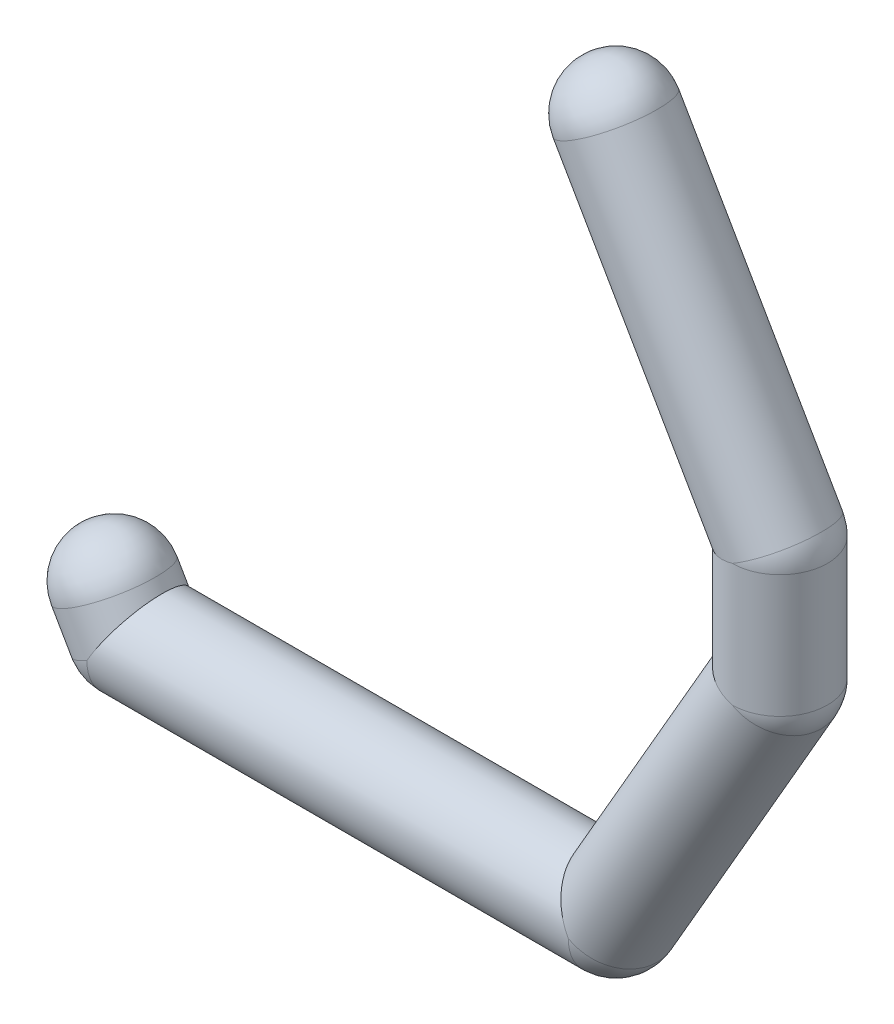
ISO-10303-21;
HEADER;
FILE_DESCRIPTION(('STEP AP214'),'2;1');
FILE_NAME('part.step','',(''),(''),'','','');
FILE_SCHEMA(('AUTOMOTIVE_DESIGN { 1 0 10303 214 1 1 1 1 }'));
ENDSEC;
DATA;
#1=APPLICATION_CONTEXT('core data for automotive mechanical design processes');
#2=APPLICATION_PROTOCOL_DEFINITION('international standard','automotive_design',2000,#1);
#3=PRODUCT_CONTEXT('',#1,'mechanical');
#4=PRODUCT('Part','Part','',(#3));
#5=PRODUCT_RELATED_PRODUCT_CATEGORY('part','',(#4));
#6=PRODUCT_DEFINITION_FORMATION('','',#4);
#7=PRODUCT_DEFINITION_CONTEXT('part definition',#1,'design');
#8=PRODUCT_DEFINITION('design','',#6,#7);
#9=PRODUCT_DEFINITION_SHAPE('','',#8);
#10=(LENGTH_UNIT() NAMED_UNIT(*) SI_UNIT(.MILLI.,.METRE.));
#11=(NAMED_UNIT(*) PLANE_ANGLE_UNIT() SI_UNIT($,.RADIAN.));
#12=(NAMED_UNIT(*) SI_UNIT($,.STERADIAN.) SOLID_ANGLE_UNIT());
#13=UNCERTAINTY_MEASURE_WITH_UNIT(LENGTH_MEASURE(1.E-05),#10,'distance_accuracy_value','');
#14=(GEOMETRIC_REPRESENTATION_CONTEXT(3) GLOBAL_UNCERTAINTY_ASSIGNED_CONTEXT((#13)) GLOBAL_UNIT_ASSIGNED_CONTEXT((#10,
#11,#12)) REPRESENTATION_CONTEXT('',''));
#15=CARTESIAN_POINT('',(0.,0.,0.));
#16=DIRECTION('',(0.,0.,1.));
#17=DIRECTION('',(1.,0.,0.));
#18=AXIS2_PLACEMENT_3D('',#15,#16,#17);
#19=CARTESIAN_POINT('',(18.741,-5.4,1.125));
#20=DIRECTION('',(1.,0.,0.));
#21=DIRECTION('',(0.,-1.,0.));
#22=AXIS2_PLACEMENT_3D('',#19,#20,#21);
#23=SPHERICAL_SURFACE('',#22,0.24);
#24=CARTESIAN_POINT('',(18.741,-5.4,1.125));
#25=DIRECTION('',(-0.50142378241352,0.865201820635,0.));
#26=DIRECTION('',(-0.865201820635,-0.50142378241352,0.));
#27=AXIS2_PLACEMENT_3D('',#24,#25,#26);
#28=CIRCLE('',#27,0.239999999999999);
#29=CARTESIAN_POINT('',(18.741,-5.4,0.885000000000001));
#30=VERTEX_POINT('',#29);
#31=CARTESIAN_POINT('',(18.741,-5.4,1.365));
#32=VERTEX_POINT('',#31);
#33=EDGE_CURVE('E102',#30,#32,#28,.T.);
#34=ORIENTED_EDGE('',*,*,#33,.F.);
#35=CARTESIAN_POINT('',(18.741,-5.4,1.125));
#36=DIRECTION('',(-1.,0.,0.));
#37=DIRECTION('',(0.,0.,1.));
#38=AXIS2_PLACEMENT_3D('',#35,#36,#37);
#39=CIRCLE('',#38,0.24);
#40=EDGE_CURVE('E103',#32,#30,#39,.F.);
#41=ORIENTED_EDGE('',*,*,#40,.F.);
#42=EDGE_LOOP('',(#34,#41));
#43=FACE_BOUND('',#42,.T.);
#44=ADVANCED_FACE('F63',(#43),#23,.T.);
#45=CARTESIAN_POINT('',(21.166,-5.4,1.125));
#46=DIRECTION('',(-1.,0.,0.));
#47=DIRECTION('',(0.,0.,1.));
#48=AXIS2_PLACEMENT_3D('',#45,#46,#47);
#49=CYLINDRICAL_SURFACE('',#48,0.24);
#50=CARTESIAN_POINT('',(18.741,-5.4,1.125));
#51=DIRECTION('',(-0.86643631687894,0.499287601281323,0.));
#52=DIRECTION('',(-0.499287601281323,-0.86643631687894,0.));
#53=AXIS2_PLACEMENT_3D('',#50,#51,#52);
#54=ELLIPSE('',#53,0.276996699381811,0.239999999999999);
#55=EDGE_CURVE('E76',#32,#30,#54,.T.);
#56=ORIENTED_EDGE('',*,*,#55,.F.);
#57=ORIENTED_EDGE('',*,*,#40,.T.);
#58=EDGE_LOOP('',(#56,#57));
#59=FACE_BOUND('',#58,.T.);
#60=CARTESIAN_POINT('',(21.166,-5.4,1.125));
#61=DIRECTION('',(-0.866000737383216,-0.500042721026639,0.));
#62=DIRECTION('',(-0.50004272102664,0.866000737383216,0.));
#63=AXIS2_PLACEMENT_3D('',#60,#61,#62);
#64=ELLIPSE('',#63,0.277136022684236,0.24);
#65=CARTESIAN_POINT('',(21.166,-5.4,0.885));
#66=VERTEX_POINT('',#65);
#67=CARTESIAN_POINT('',(21.166,-5.4,1.365));
#68=VERTEX_POINT('',#67);
#69=EDGE_CURVE('E70',#66,#68,#64,.F.);
#70=ORIENTED_EDGE('',*,*,#69,.F.);
#71=CARTESIAN_POINT('',(21.166,-5.4,1.125));
#72=DIRECTION('',(-1.,0.,0.));
#73=DIRECTION('',(0.,0.,1.));
#74=AXIS2_PLACEMENT_3D('',#71,#72,#73);
#75=CIRCLE('',#74,0.24);
#76=EDGE_CURVE('E107',#66,#68,#75,.T.);
#77=ORIENTED_EDGE('',*,*,#76,.T.);
#78=EDGE_LOOP('',(#70,#77));
#79=FACE_BOUND('',#78,.T.);
#80=ADVANCED_FACE('F106',(#59,#79),#49,.T.);
#81=CARTESIAN_POINT('',(21.166,-5.4,1.125));
#82=DIRECTION('',(1.,0.,0.));
#83=DIRECTION('',(0.,-1.,0.));
#84=AXIS2_PLACEMENT_3D('',#81,#82,#83);
#85=SPHERICAL_SURFACE('',#84,0.24);
#86=ORIENTED_EDGE('',*,*,#76,.F.);
#87=CARTESIAN_POINT('',(21.166,-5.4,1.125));
#88=DIRECTION('',(-0.499914554296549,-0.86607473026436,0.));
#89=DIRECTION('',(0.86607473026436,-0.499914554296549,0.));
#90=AXIS2_PLACEMENT_3D('',#87,#88,#89);
#91=CIRCLE('',#90,0.24);
#92=EDGE_CURVE('E128',#68,#66,#91,.F.);
#93=ORIENTED_EDGE('',*,*,#92,.F.);
#94=EDGE_LOOP('',(#86,#93));
#95=FACE_BOUND('',#94,.T.);
#96=ADVANCED_FACE('F138',(#95),#85,.T.);
#97=CARTESIAN_POINT('',(21.992,-3.96899999999999,1.125));
#98=DIRECTION('',(-0.499914554296549,-0.86607473026436,0.));
#99=DIRECTION('',(0.86607473026436,-0.499914554296549,0.));
#100=AXIS2_PLACEMENT_3D('',#97,#98,#99);
#101=CYLINDRICAL_SURFACE('',#100,0.24);
#102=CARTESIAN_POINT('',(21.992,-3.96899999999999,1.125));
#103=DIRECTION('',(-0.258771394995313,-0.965938592837133,0.));
#104=DIRECTION('',(-0.965938592837133,0.258771394995313,0.));
#105=AXIS2_PLACEMENT_3D('',#102,#103,#104);
#106=ELLIPSE('',#105,0.248462999387029,0.24);
#107=CARTESIAN_POINT('',(21.992,-3.96899999999999,0.885));
#108=VERTEX_POINT('',#107);
#109=CARTESIAN_POINT('',(21.992,-3.969,1.365));
#110=VERTEX_POINT('',#109);
#111=EDGE_CURVE('E131',#108,#110,#106,.F.);
#112=ORIENTED_EDGE('',*,*,#111,.F.);
#113=CARTESIAN_POINT('',(21.992,-3.96899999999999,1.125));
#114=DIRECTION('',(-0.499914554296552,-0.866074730264358,0.));
#115=DIRECTION('',(0.866074730264358,-0.499914554296552,0.));
#116=AXIS2_PLACEMENT_3D('',#113,#114,#115);
#117=CIRCLE('',#116,0.24);
#118=EDGE_CURVE('E126',#108,#110,#117,.T.);
#119=ORIENTED_EDGE('',*,*,#118,.T.);
#120=EDGE_LOOP('',(#112,#119));
#121=FACE_BOUND('',#120,.T.);
#122=ORIENTED_EDGE('',*,*,#92,.T.);
#123=ORIENTED_EDGE('',*,*,#69,.T.);
#124=EDGE_LOOP('',(#122,#123));
#125=FACE_BOUND('',#124,.T.);
#126=ADVANCED_FACE('F136',(#121,#125),#101,.T.);
#127=CARTESIAN_POINT('',(21.992,-3.969,1.125));
#128=DIRECTION('',(1.,0.,0.));
#129=DIRECTION('',(0.,-1.,0.));
#130=AXIS2_PLACEMENT_3D('',#127,#128,#129);
#131=SPHERICAL_SURFACE('',#130,0.24);
#132=ORIENTED_EDGE('',*,*,#118,.F.);
#133=CARTESIAN_POINT('',(21.992,-3.969,1.125));
#134=DIRECTION('',(0.,-1.,0.));
#135=DIRECTION('',(0.,0.,-1.));
#136=AXIS2_PLACEMENT_3D('',#133,#134,#135);
#137=CIRCLE('',#136,0.24);
#138=EDGE_CURVE('E120',#110,#108,#137,.F.);
#139=ORIENTED_EDGE('',*,*,#138,.F.);
#140=EDGE_LOOP('',(#132,#139));
#141=FACE_BOUND('',#140,.T.);
#142=ADVANCED_FACE('F152',(#141),#131,.T.);
#143=CARTESIAN_POINT('',(21.992,-3.351,1.125));
#144=DIRECTION('',(0.,-1.,0.));
#145=DIRECTION('',(0.,0.,-1.));
#146=AXIS2_PLACEMENT_3D('',#143,#144,#145);
#147=CYLINDRICAL_SURFACE('',#146,0.240000000000001);
#148=CARTESIAN_POINT('',(21.992,-3.35100000000001,1.125));
#149=DIRECTION('',(0.258771394995313,-0.965938592837132,0.));
#150=DIRECTION('',(-0.965938592837132,-0.258771394995313,0.));
#151=AXIS2_PLACEMENT_3D('',#148,#149,#150);
#152=ELLIPSE('',#151,0.248462999387029,0.24);
#153=CARTESIAN_POINT('',(21.992,-3.351,0.885));
#154=VERTEX_POINT('',#153);
#155=CARTESIAN_POINT('',(21.992,-3.351,1.365));
#156=VERTEX_POINT('',#155);
#157=EDGE_CURVE('E123',#154,#156,#152,.F.);
#158=ORIENTED_EDGE('',*,*,#157,.F.);
#159=CARTESIAN_POINT('',(21.992,-3.351,1.125));
#160=DIRECTION('',(0.,-1.,0.));
#161=DIRECTION('',(0.,0.,-1.));
#162=AXIS2_PLACEMENT_3D('',#159,#160,#161);
#163=CIRCLE('',#162,0.240000000000001);
#164=EDGE_CURVE('E117',#154,#156,#163,.T.);
#165=ORIENTED_EDGE('',*,*,#164,.T.);
#166=EDGE_LOOP('',(#158,#165));
#167=FACE_BOUND('',#166,.T.);
#168=ORIENTED_EDGE('',*,*,#138,.T.);
#169=ORIENTED_EDGE('',*,*,#111,.T.);
#170=EDGE_LOOP('',(#168,#169));
#171=FACE_BOUND('',#170,.T.);
#172=ADVANCED_FACE('F156',(#167,#171),#147,.T.);
#173=CARTESIAN_POINT('',(21.992,-3.351,1.125));
#174=DIRECTION('',(1.,0.,0.));
#175=DIRECTION('',(0.,-1.,0.));
#176=AXIS2_PLACEMENT_3D('',#173,#174,#175);
#177=SPHERICAL_SURFACE('',#176,0.24);
#178=ORIENTED_EDGE('',*,*,#164,.F.);
#179=CARTESIAN_POINT('',(21.992,-3.35100000000001,1.125));
#180=DIRECTION('',(0.499914554296552,-0.866074730264358,0.));
#181=DIRECTION('',(0.866074730264358,0.499914554296552,0.));
#182=AXIS2_PLACEMENT_3D('',#179,#180,#181);
#183=CIRCLE('',#182,0.24);
#184=EDGE_CURVE('E113',#154,#156,#183,.T.);
#185=ORIENTED_EDGE('',*,*,#184,.T.);
#186=EDGE_LOOP('',(#178,#185));
#187=FACE_BOUND('',#186,.T.);
#188=ADVANCED_FACE('F160',(#187),#177,.T.);
#189=CARTESIAN_POINT('',(21.166,-1.92000000000001,1.125));
#190=DIRECTION('',(0.499914554296549,-0.86607473026436,0.));
#191=DIRECTION('',(0.86607473026436,0.499914554296549,0.));
#192=AXIS2_PLACEMENT_3D('',#189,#190,#191);
#193=CYLINDRICAL_SURFACE('',#192,0.24);
#194=ORIENTED_EDGE('',*,*,#184,.F.);
#195=ORIENTED_EDGE('',*,*,#157,.T.);
#196=EDGE_LOOP('',(#194,#195));
#197=FACE_BOUND('',#196,.T.);
#198=CARTESIAN_POINT('',(21.166,-1.92000000000001,1.125));
#199=DIRECTION('',(0.499914554296552,-0.866074730264358,0.));
#200=DIRECTION('',(0.866074730264358,0.499914554296552,0.));
#201=AXIS2_PLACEMENT_3D('',#198,#199,#200);
#202=CIRCLE('',#201,0.24);
#203=CARTESIAN_POINT('',(21.3738579352634,-1.80002050696883,1.125));
#204=VERTEX_POINT('',#203);
#205=EDGE_CURVE('E110',#204,#204,#202,.T.);
#206=ORIENTED_EDGE('',*,*,#205,.T.);
#207=EDGE_LOOP('',(#206));
#208=FACE_BOUND('',#207,.T.);
#209=ADVANCED_FACE('F165',(#197,#208),#193,.T.);
#210=CARTESIAN_POINT('',(21.166,-1.92,1.125));
#211=DIRECTION('',(1.,0.,0.));
#212=DIRECTION('',(0.,-1.,0.));
#213=AXIS2_PLACEMENT_3D('',#210,#211,#212);
#214=SPHERICAL_SURFACE('',#213,0.24);
#215=CARTESIAN_POINT('',(21.166,-1.92,1.125));
#216=DIRECTION('',(0.499914554296552,-0.866074730264358,0.));
#217=DIRECTION('',(0.866074730264358,0.499914554296552,0.));
#218=AXIS2_PLACEMENT_3D('',#215,#216,#217);
#219=SPHERICAL_SURFACE('',#218,0.24);
#220=ORIENTED_EDGE('',*,*,#205,.F.);
#221=EDGE_LOOP('',(#220));
#222=FACE_BOUND('',#221,.T.);
#223=ADVANCED_FACE('F162',(#222),#219,.T.);
#224=CARTESIAN_POINT('',(18.741,-5.4,1.125));
#225=DIRECTION('',(-0.501423782413485,0.86520182063502,0.));
#226=DIRECTION('',(-0.86520182063502,-0.501423782413485,0.));
#227=AXIS2_PLACEMENT_3D('',#224,#225,#226);
#228=CYLINDRICAL_SURFACE('',#227,0.239999999999999);
#229=CARTESIAN_POINT('',(18.639,-5.224,1.125));
#230=DIRECTION('',(-0.501423782413485,0.86520182063502,0.));
#231=DIRECTION('',(-0.86520182063502,-0.501423782413485,0.));
#232=AXIS2_PLACEMENT_3D('',#229,#230,#231);
#233=CIRCLE('',#232,0.24);
#234=CARTESIAN_POINT('',(18.4313515630476,-5.34434170777924,1.125));
#235=VERTEX_POINT('',#234);
#236=EDGE_CURVE('E12',#235,#235,#233,.F.);
#237=ORIENTED_EDGE('',*,*,#236,.T.);
#238=EDGE_LOOP('',(#237));
#239=FACE_BOUND('',#238,.T.);
#240=ORIENTED_EDGE('',*,*,#33,.T.);
#241=ORIENTED_EDGE('',*,*,#55,.T.);
#242=EDGE_LOOP('',(#240,#241));
#243=FACE_BOUND('',#242,.T.);
#244=ADVANCED_FACE('F109',(#239,#243),#228,.T.);
#245=CARTESIAN_POINT('',(18.639,-5.224,1.125));
#246=DIRECTION('',(1.,0.,0.));
#247=DIRECTION('',(0.,-1.,0.));
#248=AXIS2_PLACEMENT_3D('',#245,#246,#247);
#249=SPHERICAL_SURFACE('',#248,0.24);
#250=CARTESIAN_POINT('',(18.639,-5.224,1.125));
#251=DIRECTION('',(-0.501423782413485,0.86520182063502,0.));
#252=DIRECTION('',(-0.86520182063502,-0.501423782413485,0.));
#253=AXIS2_PLACEMENT_3D('',#250,#251,#252);
#254=SPHERICAL_SURFACE('',#253,0.24);
#255=ORIENTED_EDGE('',*,*,#236,.F.);
#256=EDGE_LOOP('',(#255));
#257=FACE_BOUND('',#256,.T.);
#258=ADVANCED_FACE('F146',(#257),#254,.T.);
#259=CLOSED_SHELL('',(#44,#80,#96,#126,#142,#172,#188,#209,#223,#244,#258));
#260=MANIFOLD_SOLID_BREP('B2',#259);
#261=ADVANCED_BREP_SHAPE_REPRESENTATION('',(#18,#260),#14);
#262=SHAPE_DEFINITION_REPRESENTATION(#9,#261);
ENDSEC;
END-ISO-10303-21;
